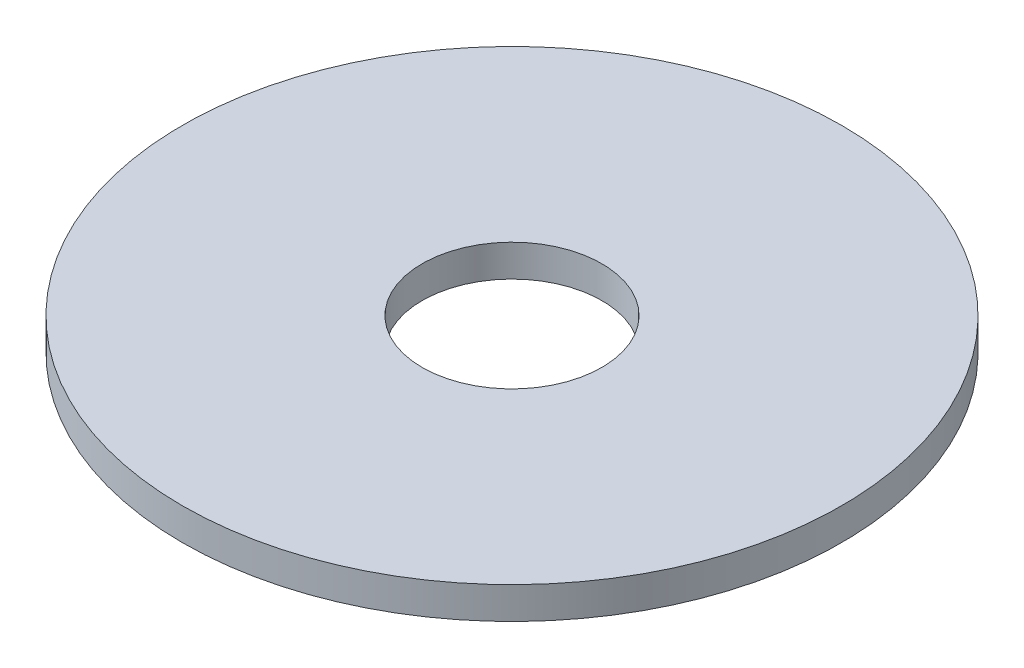
ISO-10303-21;
HEADER;
FILE_DESCRIPTION(('STEP AP214'),'2;1');
FILE_NAME('part.step','',(''),(''),'','','');
FILE_SCHEMA(('AUTOMOTIVE_DESIGN { 1 0 10303 214 1 1 1 1 }'));
ENDSEC;
DATA;
#1=APPLICATION_CONTEXT('core data for automotive mechanical design processes');
#2=APPLICATION_PROTOCOL_DEFINITION('international standard','automotive_design',2000,#1);
#3=PRODUCT_CONTEXT('',#1,'mechanical');
#4=PRODUCT('Part','Part','',(#3));
#5=PRODUCT_RELATED_PRODUCT_CATEGORY('part','',(#4));
#6=PRODUCT_DEFINITION_FORMATION('','',#4);
#7=PRODUCT_DEFINITION_CONTEXT('part definition',#1,'design');
#8=PRODUCT_DEFINITION('design','',#6,#7);
#9=PRODUCT_DEFINITION_SHAPE('','',#8);
#10=(LENGTH_UNIT() NAMED_UNIT(*) SI_UNIT(.MILLI.,.METRE.));
#11=(NAMED_UNIT(*) PLANE_ANGLE_UNIT() SI_UNIT($,.RADIAN.));
#12=(NAMED_UNIT(*) SI_UNIT($,.STERADIAN.) SOLID_ANGLE_UNIT());
#13=UNCERTAINTY_MEASURE_WITH_UNIT(LENGTH_MEASURE(1.E-05),#10,'distance_accuracy_value','');
#14=(GEOMETRIC_REPRESENTATION_CONTEXT(3) GLOBAL_UNCERTAINTY_ASSIGNED_CONTEXT((#13)) GLOBAL_UNIT_ASSIGNED_CONTEXT((#10,
#11,#12)) REPRESENTATION_CONTEXT('',''));
#15=CARTESIAN_POINT('',(0.,0.,0.));
#16=DIRECTION('',(0.,0.,1.));
#17=DIRECTION('',(1.,0.,0.));
#18=AXIS2_PLACEMENT_3D('',#15,#16,#17);
#19=CARTESIAN_POINT('',(0.,0.8,0.));
#20=DIRECTION('',(0.,-1.,0.));
#21=DIRECTION('',(0.,0.,-1.));
#22=AXIS2_PLACEMENT_3D('',#19,#20,#21);
#23=CYLINDRICAL_SURFACE('',#22,8.25);
#24=CARTESIAN_POINT('',(0.,0.8,0.));
#25=DIRECTION('',(0.,1.,0.));
#26=DIRECTION('',(0.,0.,1.));
#27=AXIS2_PLACEMENT_3D('',#24,#25,#26);
#28=CIRCLE('',#27,8.25);
#29=CARTESIAN_POINT('',(0.,0.8,8.25));
#30=VERTEX_POINT('',#29);
#31=EDGE_CURVE('E10',#30,#30,#28,.T.);
#32=ORIENTED_EDGE('',*,*,#31,.F.);
#33=EDGE_LOOP('',(#32));
#34=FACE_BOUND('',#33,.T.);
#35=CARTESIAN_POINT('',(0.,0.,0.));
#36=DIRECTION('',(0.,1.,0.));
#37=DIRECTION('',(0.,0.,1.));
#38=AXIS2_PLACEMENT_3D('',#35,#36,#37);
#39=CIRCLE('',#38,8.25);
#40=CARTESIAN_POINT('',(0.,0.,8.25));
#41=VERTEX_POINT('',#40);
#42=EDGE_CURVE('E51',#41,#41,#39,.T.);
#43=ORIENTED_EDGE('',*,*,#42,.T.);
#44=EDGE_LOOP('',(#43));
#45=FACE_BOUND('',#44,.T.);
#46=ADVANCED_FACE('F43',(#34,#45),#23,.T.);
#47=CARTESIAN_POINT('',(0.,0.8,0.));
#48=DIRECTION('',(0.,1.,0.));
#49=DIRECTION('',(0.,0.,1.));
#50=AXIS2_PLACEMENT_3D('',#47,#48,#49);
#51=PLANE('',#50);
#52=CARTESIAN_POINT('',(0.,0.8,0.));
#53=DIRECTION('',(0.,1.,0.));
#54=DIRECTION('',(0.,0.,1.));
#55=AXIS2_PLACEMENT_3D('',#52,#53,#54);
#56=CIRCLE('',#55,2.25);
#57=CARTESIAN_POINT('',(0.,0.8,2.25));
#58=VERTEX_POINT('',#57);
#59=EDGE_CURVE('E58',#58,#58,#56,.T.);
#60=ORIENTED_EDGE('',*,*,#59,.F.);
#61=EDGE_LOOP('',(#60));
#62=FACE_BOUND('',#61,.T.);
#63=ORIENTED_EDGE('',*,*,#31,.T.);
#64=EDGE_LOOP('',(#63));
#65=FACE_BOUND('',#64,.T.);
#66=ADVANCED_FACE('F76',(#62,#65),#51,.T.);
#67=CARTESIAN_POINT('',(0.,0.,0.));
#68=DIRECTION('',(0.,1.,0.));
#69=DIRECTION('',(0.,0.,1.));
#70=AXIS2_PLACEMENT_3D('',#67,#68,#69);
#71=PLANE('',#70);
#72=CARTESIAN_POINT('',(0.,0.,0.));
#73=DIRECTION('',(0.,1.,0.));
#74=DIRECTION('',(0.,0.,1.));
#75=AXIS2_PLACEMENT_3D('',#72,#73,#74);
#76=CIRCLE('',#75,2.25);
#77=CARTESIAN_POINT('',(0.,0.,2.25));
#78=VERTEX_POINT('',#77);
#79=EDGE_CURVE('E46',#78,#78,#76,.T.);
#80=ORIENTED_EDGE('',*,*,#79,.T.);
#81=EDGE_LOOP('',(#80));
#82=FACE_BOUND('',#81,.T.);
#83=ORIENTED_EDGE('',*,*,#42,.F.);
#84=EDGE_LOOP('',(#83));
#85=FACE_BOUND('',#84,.T.);
#86=ADVANCED_FACE('F67',(#82,#85),#71,.F.);
#87=CARTESIAN_POINT('',(0.,-4.2,0.));
#88=DIRECTION('',(0.,1.,0.));
#89=DIRECTION('',(0.,0.,1.));
#90=AXIS2_PLACEMENT_3D('',#87,#88,#89);
#91=CYLINDRICAL_SURFACE('',#90,2.25);
#92=ORIENTED_EDGE('',*,*,#59,.T.);
#93=EDGE_LOOP('',(#92));
#94=FACE_BOUND('',#93,.T.);
#95=ORIENTED_EDGE('',*,*,#79,.F.);
#96=EDGE_LOOP('',(#95));
#97=FACE_BOUND('',#96,.T.);
#98=ADVANCED_FACE('F70',(#94,#97),#91,.F.);
#99=CLOSED_SHELL('',(#46,#66,#86,#98));
#100=MANIFOLD_SOLID_BREP('B2',#99);
#101=ADVANCED_BREP_SHAPE_REPRESENTATION('',(#18,#100),#14);
#102=SHAPE_DEFINITION_REPRESENTATION(#9,#101);
ENDSEC;
END-ISO-10303-21;
